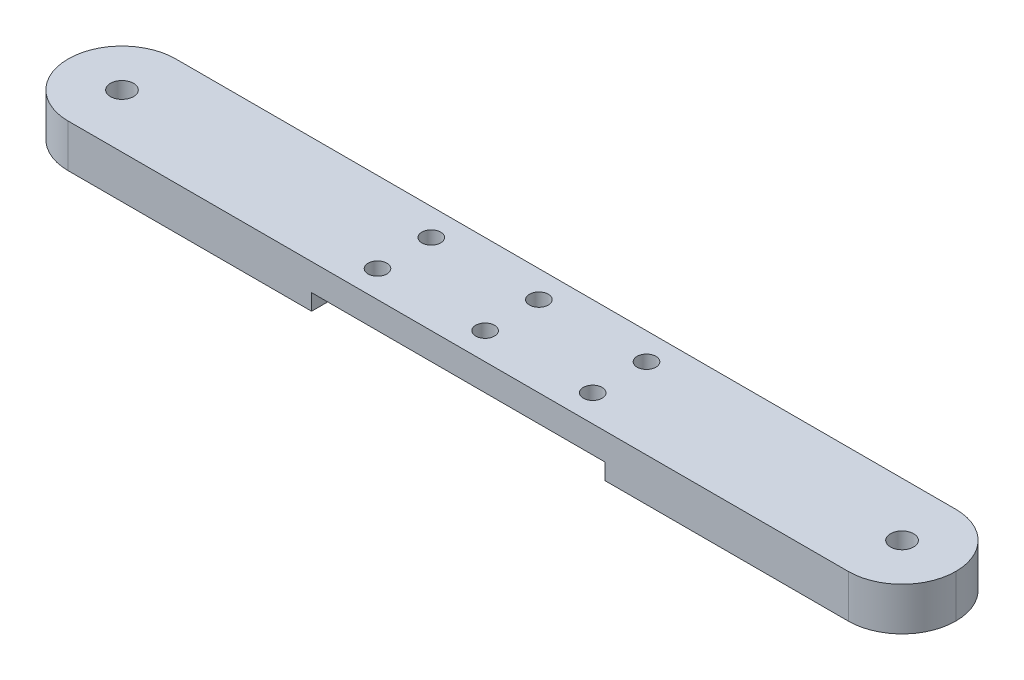
ISO-10303-21;
HEADER;
FILE_DESCRIPTION(('STEP AP214'),'2;1');
FILE_NAME('part.step','',(''),(''),'','','');
FILE_SCHEMA(('AUTOMOTIVE_DESIGN { 1 0 10303 214 1 1 1 1 }'));
ENDSEC;
DATA;
#1=APPLICATION_CONTEXT('core data for automotive mechanical design processes');
#2=APPLICATION_PROTOCOL_DEFINITION('international standard','automotive_design',2000,#1);
#3=PRODUCT_CONTEXT('',#1,'mechanical');
#4=PRODUCT('Part','Part','',(#3));
#5=PRODUCT_RELATED_PRODUCT_CATEGORY('part','',(#4));
#6=PRODUCT_DEFINITION_FORMATION('','',#4);
#7=PRODUCT_DEFINITION_CONTEXT('part definition',#1,'design');
#8=PRODUCT_DEFINITION('design','',#6,#7);
#9=PRODUCT_DEFINITION_SHAPE('','',#8);
#10=(LENGTH_UNIT() NAMED_UNIT(*) SI_UNIT(.MILLI.,.METRE.));
#11=(NAMED_UNIT(*) PLANE_ANGLE_UNIT() SI_UNIT($,.RADIAN.));
#12=(NAMED_UNIT(*) SI_UNIT($,.STERADIAN.) SOLID_ANGLE_UNIT());
#13=UNCERTAINTY_MEASURE_WITH_UNIT(LENGTH_MEASURE(1.E-05),#10,'distance_accuracy_value','');
#14=(GEOMETRIC_REPRESENTATION_CONTEXT(3) GLOBAL_UNCERTAINTY_ASSIGNED_CONTEXT((#13)) GLOBAL_UNIT_ASSIGNED_CONTEXT((#10,
#11,#12)) REPRESENTATION_CONTEXT('',''));
#15=CARTESIAN_POINT('',(0.,0.,0.));
#16=DIRECTION('',(0.,0.,1.));
#17=DIRECTION('',(1.,0.,0.));
#18=AXIS2_PLACEMENT_3D('',#15,#16,#17);
#19=CARTESIAN_POINT('',(-81.75,5.49999999999998,20.));
#20=DIRECTION('',(0.,-1.,0.));
#21=DIRECTION('',(0.,0.,-1.));
#22=AXIS2_PLACEMENT_3D('',#19,#20,#21);
#23=PLANE('',#22);
#24=CARTESIAN_POINT('',(-71.75,5.49999999999998,10.));
#25=DIRECTION('',(0.,1.,0.));
#26=DIRECTION('',(0.,0.,1.));
#27=AXIS2_PLACEMENT_3D('',#24,#25,#26);
#28=CIRCLE('',#27,2.15);
#29=CARTESIAN_POINT('',(-71.75,5.49999999999998,12.15));
#30=VERTEX_POINT('',#29);
#31=EDGE_CURVE('E193',#30,#30,#28,.T.);
#32=ORIENTED_EDGE('',*,*,#31,.F.);
#33=EDGE_LOOP('',(#32));
#34=FACE_BOUND('',#33,.T.);
#35=CARTESIAN_POINT('',(20.75,5.49999999999998,5.));
#36=DIRECTION('',(0.,1.,0.));
#37=DIRECTION('',(0.,0.,1.));
#38=AXIS2_PLACEMENT_3D('',#35,#36,#37);
#39=CIRCLE('',#38,1.75);
#40=CARTESIAN_POINT('',(20.75,5.49999999999998,6.75));
#41=VERTEX_POINT('',#40);
#42=EDGE_CURVE('E283',#41,#41,#39,.T.);
#43=ORIENTED_EDGE('',*,*,#42,.F.);
#44=EDGE_LOOP('',(#43));
#45=FACE_BOUND('',#44,.T.);
#46=CARTESIAN_POINT('',(0.750000000000004,5.49999999999998,5.));
#47=DIRECTION('',(0.,1.,0.));
#48=DIRECTION('',(0.,0.,1.));
#49=AXIS2_PLACEMENT_3D('',#46,#47,#48);
#50=CIRCLE('',#49,1.75);
#51=CARTESIAN_POINT('',(0.750000000000004,5.49999999999998,6.75));
#52=VERTEX_POINT('',#51);
#53=EDGE_CURVE('E289',#52,#52,#50,.T.);
#54=ORIENTED_EDGE('',*,*,#53,.F.);
#55=EDGE_LOOP('',(#54));
#56=FACE_BOUND('',#55,.T.);
#57=CARTESIAN_POINT('',(-19.25,5.49999999999998,5.));
#58=DIRECTION('',(0.,1.,0.));
#59=DIRECTION('',(0.,0.,1.));
#60=AXIS2_PLACEMENT_3D('',#57,#58,#59);
#61=CIRCLE('',#60,1.75);
#62=CARTESIAN_POINT('',(-19.25,5.49999999999998,6.75));
#63=VERTEX_POINT('',#62);
#64=EDGE_CURVE('E284',#63,#63,#61,.T.);
#65=ORIENTED_EDGE('',*,*,#64,.F.);
#66=EDGE_LOOP('',(#65));
#67=FACE_BOUND('',#66,.T.);
#68=CARTESIAN_POINT('',(73.25,5.49999999999998,10.));
#69=DIRECTION('',(0.,1.,0.));
#70=DIRECTION('',(0.,0.,1.));
#71=AXIS2_PLACEMENT_3D('',#68,#69,#70);
#72=CIRCLE('',#71,2.15);
#73=CARTESIAN_POINT('',(73.25,5.49999999999998,12.15));
#74=VERTEX_POINT('',#73);
#75=EDGE_CURVE('E288',#74,#74,#72,.T.);
#76=ORIENTED_EDGE('',*,*,#75,.F.);
#77=EDGE_LOOP('',(#76));
#78=FACE_BOUND('',#77,.T.);
#79=CARTESIAN_POINT('',(20.75,5.49999999999998,15.));
#80=DIRECTION('',(0.,1.,0.));
#81=DIRECTION('',(0.,0.,1.));
#82=AXIS2_PLACEMENT_3D('',#79,#80,#81);
#83=CIRCLE('',#82,1.75);
#84=CARTESIAN_POINT('',(20.75,5.49999999999998,16.75));
#85=VERTEX_POINT('',#84);
#86=EDGE_CURVE('E279',#85,#85,#83,.T.);
#87=ORIENTED_EDGE('',*,*,#86,.F.);
#88=EDGE_LOOP('',(#87));
#89=FACE_BOUND('',#88,.T.);
#90=CARTESIAN_POINT('',(0.750000000000004,5.49999999999998,15.));
#91=DIRECTION('',(0.,1.,0.));
#92=DIRECTION('',(0.,0.,1.));
#93=AXIS2_PLACEMENT_3D('',#90,#91,#92);
#94=CIRCLE('',#93,1.75);
#95=CARTESIAN_POINT('',(0.750000000000004,5.49999999999998,16.75));
#96=VERTEX_POINT('',#95);
#97=EDGE_CURVE('E261',#96,#96,#94,.T.);
#98=ORIENTED_EDGE('',*,*,#97,.F.);
#99=EDGE_LOOP('',(#98));
#100=FACE_BOUND('',#99,.T.);
#101=CARTESIAN_POINT('',(-19.25,5.49999999999998,15.));
#102=DIRECTION('',(0.,1.,0.));
#103=DIRECTION('',(0.,0.,1.));
#104=AXIS2_PLACEMENT_3D('',#101,#102,#103);
#105=CIRCLE('',#104,1.75);
#106=CARTESIAN_POINT('',(-19.25,5.49999999999998,16.75));
#107=VERTEX_POINT('',#106);
#108=EDGE_CURVE('E254',#107,#107,#105,.T.);
#109=ORIENTED_EDGE('',*,*,#108,.F.);
#110=EDGE_LOOP('',(#109));
#111=FACE_BOUND('',#110,.T.);
#112=CARTESIAN_POINT('',(73.25,5.49999999999998,10.));
#113=DIRECTION('',(0.,-1.,0.));
#114=DIRECTION('',(0.,0.,-1.));
#115=AXIS2_PLACEMENT_3D('',#112,#113,#114);
#116=CIRCLE('',#115,10.);
#117=CARTESIAN_POINT('',(73.25,5.49999999999998,20.));
#118=VERTEX_POINT('',#117);
#119=CARTESIAN_POINT('',(83.25,5.49999999999998,10.));
#120=VERTEX_POINT('',#119);
#121=EDGE_CURVE('E225',#118,#120,#116,.F.);
#122=ORIENTED_EDGE('',*,*,#121,.T.);
#123=CARTESIAN_POINT('',(73.25,5.49999999999998,10.));
#124=DIRECTION('',(0.,-1.,0.));
#125=DIRECTION('',(0.,0.,-1.));
#126=AXIS2_PLACEMENT_3D('',#123,#124,#125);
#127=CIRCLE('',#126,10.);
#128=CARTESIAN_POINT('',(73.25,5.49999999999998,0.));
#129=VERTEX_POINT('',#128);
#130=EDGE_CURVE('E228',#120,#129,#127,.F.);
#131=ORIENTED_EDGE('',*,*,#130,.T.);
#132=DIRECTION('',(-1.,0.,0.));
#133=VECTOR('',#132,1.);
#134=CARTESIAN_POINT('',(-81.75,5.49999999999998,0.));
#135=LINE('',#134,#133);
#136=CARTESIAN_POINT('',(-71.75,5.49999999999998,0.));
#137=VERTEX_POINT('',#136);
#138=EDGE_CURVE('E159',#129,#137,#135,.T.);
#139=ORIENTED_EDGE('',*,*,#138,.T.);
#140=CARTESIAN_POINT('',(-71.75,5.49999999999998,10.));
#141=DIRECTION('',(0.,-1.,0.));
#142=DIRECTION('',(0.,0.,-1.));
#143=AXIS2_PLACEMENT_3D('',#140,#141,#142);
#144=CIRCLE('',#143,10.);
#145=CARTESIAN_POINT('',(-81.75,5.49999999999998,10.));
#146=VERTEX_POINT('',#145);
#147=EDGE_CURVE('E222',#137,#146,#144,.F.);
#148=ORIENTED_EDGE('',*,*,#147,.T.);
#149=CARTESIAN_POINT('',(-71.75,5.49999999999998,10.));
#150=DIRECTION('',(0.,-1.,0.));
#151=DIRECTION('',(0.,0.,-1.));
#152=AXIS2_PLACEMENT_3D('',#149,#150,#151);
#153=CIRCLE('',#152,10.);
#154=CARTESIAN_POINT('',(-71.75,5.49999999999998,20.));
#155=VERTEX_POINT('',#154);
#156=EDGE_CURVE('E139',#146,#155,#153,.F.);
#157=ORIENTED_EDGE('',*,*,#156,.T.);
#158=DIRECTION('',(-1.,0.,0.));
#159=VECTOR('',#158,1.);
#160=CARTESIAN_POINT('',(-81.75,5.49999999999998,20.));
#161=LINE('',#160,#159);
#162=EDGE_CURVE('E129',#118,#155,#161,.T.);
#163=ORIENTED_EDGE('',*,*,#162,.F.);
#164=EDGE_LOOP('',(#122,#131,#139,#148,#157,#163));
#165=FACE_BOUND('',#164,.T.);
#166=ADVANCED_FACE('F45',(#34,#45,#56,#67,#78,#89,#100,#111,#165),#23,.F.);
#167=CARTESIAN_POINT('',(-81.75,-2.50000000000002,20.));
#168=DIRECTION('',(0.,1.,0.));
#169=DIRECTION('',(0.,0.,1.));
#170=AXIS2_PLACEMENT_3D('',#167,#168,#169);
#171=PLANE('',#170);
#172=CARTESIAN_POINT('',(-71.75,-2.50000000000002,10.));
#173=DIRECTION('',(0.,1.,0.));
#174=DIRECTION('',(0.,0.,1.));
#175=AXIS2_PLACEMENT_3D('',#172,#173,#174);
#176=CIRCLE('',#175,2.15);
#177=CARTESIAN_POINT('',(-71.75,-2.50000000000002,12.15));
#178=VERTEX_POINT('',#177);
#179=EDGE_CURVE('E163',#178,#178,#176,.T.);
#180=ORIENTED_EDGE('',*,*,#179,.T.);
#181=EDGE_LOOP('',(#180));
#182=FACE_BOUND('',#181,.T.);
#183=CARTESIAN_POINT('',(-71.75,-2.50000000000002,10.));
#184=DIRECTION('',(0.,1.,0.));
#185=DIRECTION('',(0.,0.,1.));
#186=AXIS2_PLACEMENT_3D('',#183,#184,#185);
#187=CIRCLE('',#186,10.);
#188=CARTESIAN_POINT('',(-71.75,-2.50000000000002,20.));
#189=VERTEX_POINT('',#188);
#190=CARTESIAN_POINT('',(-81.75,-2.50000000000002,10.));
#191=VERTEX_POINT('',#190);
#192=EDGE_CURVE('E55',#189,#191,#187,.F.);
#193=ORIENTED_EDGE('',*,*,#192,.T.);
#194=CARTESIAN_POINT('',(-71.75,-2.50000000000002,10.));
#195=DIRECTION('',(0.,1.,0.));
#196=DIRECTION('',(0.,0.,1.));
#197=AXIS2_PLACEMENT_3D('',#194,#195,#196);
#198=CIRCLE('',#197,10.);
#199=CARTESIAN_POINT('',(-71.75,-2.50000000000002,0.));
#200=VERTEX_POINT('',#199);
#201=EDGE_CURVE('E11',#191,#200,#198,.F.);
#202=ORIENTED_EDGE('',*,*,#201,.T.);
#203=DIRECTION('',(1.,0.,0.));
#204=VECTOR('',#203,1.);
#205=CARTESIAN_POINT('',(-81.75,-2.50000000000002,0.));
#206=LINE('',#205,#204);
#207=CARTESIAN_POINT('',(-26.5,-2.50000000000002,0.));
#208=VERTEX_POINT('',#207);
#209=EDGE_CURVE('E135',#200,#208,#206,.T.);
#210=ORIENTED_EDGE('',*,*,#209,.T.);
#211=DIRECTION('',(0.,0.,-1.));
#212=VECTOR('',#211,1.);
#213=CARTESIAN_POINT('',(-26.5,-2.50000000000002,20.));
#214=LINE('',#213,#212);
#215=CARTESIAN_POINT('',(-26.5,-2.50000000000002,20.));
#216=VERTEX_POINT('',#215);
#217=EDGE_CURVE('E132',#216,#208,#214,.T.);
#218=ORIENTED_EDGE('',*,*,#217,.F.);
#219=DIRECTION('',(1.,0.,0.));
#220=VECTOR('',#219,1.);
#221=CARTESIAN_POINT('',(-81.75,-2.50000000000002,20.));
#222=LINE('',#221,#220);
#223=EDGE_CURVE('E121',#189,#216,#222,.T.);
#224=ORIENTED_EDGE('',*,*,#223,.F.);
#225=EDGE_LOOP('',(#193,#202,#210,#218,#224));
#226=FACE_BOUND('',#225,.T.);
#227=ADVANCED_FACE('F133',(#182,#226),#171,.F.);
#228=CARTESIAN_POINT('',(-26.5,-2.50000000000002,20.));
#229=DIRECTION('',(-1.,0.,0.));
#230=DIRECTION('',(0.,-1.,0.));
#231=AXIS2_PLACEMENT_3D('',#228,#229,#230);
#232=PLANE('',#231);
#233=DIRECTION('',(0.,1.,0.));
#234=VECTOR('',#233,1.);
#235=CARTESIAN_POINT('',(-26.5,-2.50000000000002,0.));
#236=LINE('',#235,#234);
#237=CARTESIAN_POINT('',(-26.5,0.499999999999984,0.));
#238=VERTEX_POINT('',#237);
#239=EDGE_CURVE('E166',#208,#238,#236,.T.);
#240=ORIENTED_EDGE('',*,*,#239,.T.);
#241=DIRECTION('',(0.,0.,-1.));
#242=VECTOR('',#241,1.);
#243=CARTESIAN_POINT('',(-26.5,0.499999999999984,20.));
#244=LINE('',#243,#242);
#245=CARTESIAN_POINT('',(-26.5,0.499999999999984,20.));
#246=VERTEX_POINT('',#245);
#247=EDGE_CURVE('E140',#246,#238,#244,.T.);
#248=ORIENTED_EDGE('',*,*,#247,.F.);
#249=DIRECTION('',(0.,1.,0.));
#250=VECTOR('',#249,1.);
#251=CARTESIAN_POINT('',(-26.5,-2.50000000000002,20.));
#252=LINE('',#251,#250);
#253=EDGE_CURVE('E126',#216,#246,#252,.T.);
#254=ORIENTED_EDGE('',*,*,#253,.F.);
#255=ORIENTED_EDGE('',*,*,#217,.T.);
#256=EDGE_LOOP('',(#240,#248,#254,#255));
#257=FACE_BOUND('',#256,.T.);
#258=ADVANCED_FACE('F142',(#257),#232,.F.);
#259=CARTESIAN_POINT('',(-26.5,0.499999999999984,20.));
#260=DIRECTION('',(0.,1.,0.));
#261=DIRECTION('',(0.,0.,1.));
#262=AXIS2_PLACEMENT_3D('',#259,#260,#261);
#263=PLANE('',#262);
#264=CARTESIAN_POINT('',(20.75,0.499999999999985,5.));
#265=DIRECTION('',(0.,1.,0.));
#266=DIRECTION('',(0.,0.,1.));
#267=AXIS2_PLACEMENT_3D('',#264,#265,#266);
#268=CIRCLE('',#267,1.75);
#269=CARTESIAN_POINT('',(20.75,0.499999999999985,6.75));
#270=VERTEX_POINT('',#269);
#271=EDGE_CURVE('E213',#270,#270,#268,.T.);
#272=ORIENTED_EDGE('',*,*,#271,.T.);
#273=EDGE_LOOP('',(#272));
#274=FACE_BOUND('',#273,.T.);
#275=CARTESIAN_POINT('',(0.750000000000004,0.499999999999985,5.));
#276=DIRECTION('',(0.,1.,0.));
#277=DIRECTION('',(0.,0.,1.));
#278=AXIS2_PLACEMENT_3D('',#275,#276,#277);
#279=CIRCLE('',#278,1.75);
#280=CARTESIAN_POINT('',(0.750000000000004,0.499999999999985,6.75));
#281=VERTEX_POINT('',#280);
#282=EDGE_CURVE('E209',#281,#281,#279,.T.);
#283=ORIENTED_EDGE('',*,*,#282,.T.);
#284=EDGE_LOOP('',(#283));
#285=FACE_BOUND('',#284,.T.);
#286=CARTESIAN_POINT('',(-19.25,0.499999999999985,5.));
#287=DIRECTION('',(0.,1.,0.));
#288=DIRECTION('',(0.,0.,1.));
#289=AXIS2_PLACEMENT_3D('',#286,#287,#288);
#290=CIRCLE('',#289,1.75);
#291=CARTESIAN_POINT('',(-19.25,0.499999999999985,6.75));
#292=VERTEX_POINT('',#291);
#293=EDGE_CURVE('E205',#292,#292,#290,.T.);
#294=ORIENTED_EDGE('',*,*,#293,.T.);
#295=EDGE_LOOP('',(#294));
#296=FACE_BOUND('',#295,.T.);
#297=CARTESIAN_POINT('',(20.75,0.499999999999985,15.));
#298=DIRECTION('',(0.,1.,0.));
#299=DIRECTION('',(0.,0.,1.));
#300=AXIS2_PLACEMENT_3D('',#297,#298,#299);
#301=CIRCLE('',#300,1.75);
#302=CARTESIAN_POINT('',(20.75,0.499999999999985,16.75));
#303=VERTEX_POINT('',#302);
#304=EDGE_CURVE('E201',#303,#303,#301,.T.);
#305=ORIENTED_EDGE('',*,*,#304,.T.);
#306=EDGE_LOOP('',(#305));
#307=FACE_BOUND('',#306,.T.);
#308=CARTESIAN_POINT('',(0.750000000000004,0.499999999999985,15.));
#309=DIRECTION('',(0.,1.,0.));
#310=DIRECTION('',(0.,0.,1.));
#311=AXIS2_PLACEMENT_3D('',#308,#309,#310);
#312=CIRCLE('',#311,1.75);
#313=CARTESIAN_POINT('',(0.750000000000004,0.499999999999985,16.75));
#314=VERTEX_POINT('',#313);
#315=EDGE_CURVE('E197',#314,#314,#312,.T.);
#316=ORIENTED_EDGE('',*,*,#315,.T.);
#317=EDGE_LOOP('',(#316));
#318=FACE_BOUND('',#317,.T.);
#319=CARTESIAN_POINT('',(-19.25,0.499999999999985,15.));
#320=DIRECTION('',(0.,1.,0.));
#321=DIRECTION('',(0.,0.,1.));
#322=AXIS2_PLACEMENT_3D('',#319,#320,#321);
#323=CIRCLE('',#322,1.75);
#324=CARTESIAN_POINT('',(-19.25,0.499999999999985,16.75));
#325=VERTEX_POINT('',#324);
#326=EDGE_CURVE('E192',#325,#325,#323,.T.);
#327=ORIENTED_EDGE('',*,*,#326,.T.);
#328=EDGE_LOOP('',(#327));
#329=FACE_BOUND('',#328,.T.);
#330=DIRECTION('',(1.,0.,0.));
#331=VECTOR('',#330,1.);
#332=CARTESIAN_POINT('',(-26.5,0.499999999999984,0.));
#333=LINE('',#332,#331);
#334=CARTESIAN_POINT('',(28.,0.499999999999984,0.));
#335=VERTEX_POINT('',#334);
#336=EDGE_CURVE('E169',#238,#335,#333,.T.);
#337=ORIENTED_EDGE('',*,*,#336,.T.);
#338=DIRECTION('',(0.,0.,-1.));
#339=VECTOR('',#338,1.);
#340=CARTESIAN_POINT('',(28.,0.499999999999984,20.));
#341=LINE('',#340,#339);
#342=CARTESIAN_POINT('',(28.,0.499999999999984,20.));
#343=VERTEX_POINT('',#342);
#344=EDGE_CURVE('E182',#343,#335,#341,.T.);
#345=ORIENTED_EDGE('',*,*,#344,.F.);
#346=DIRECTION('',(1.,0.,0.));
#347=VECTOR('',#346,1.);
#348=CARTESIAN_POINT('',(-26.5,0.499999999999984,20.));
#349=LINE('',#348,#347);
#350=EDGE_CURVE('E146',#246,#343,#349,.T.);
#351=ORIENTED_EDGE('',*,*,#350,.F.);
#352=ORIENTED_EDGE('',*,*,#247,.T.);
#353=EDGE_LOOP('',(#337,#345,#351,#352));
#354=FACE_BOUND('',#353,.T.);
#355=ADVANCED_FACE('F331',(#274,#285,#296,#307,#318,#329,#354),#263,.F.);
#356=CARTESIAN_POINT('',(28.,-2.50000000000002,20.));
#357=DIRECTION('',(1.,0.,0.));
#358=DIRECTION('',(0.,0.,-1.));
#359=AXIS2_PLACEMENT_3D('',#356,#357,#358);
#360=PLANE('',#359);
#361=DIRECTION('',(0.,-1.,0.));
#362=VECTOR('',#361,1.);
#363=CARTESIAN_POINT('',(28.,-2.50000000000002,0.));
#364=LINE('',#363,#362);
#365=CARTESIAN_POINT('',(28.,-2.50000000000002,0.));
#366=VERTEX_POINT('',#365);
#367=EDGE_CURVE('E172',#335,#366,#364,.T.);
#368=ORIENTED_EDGE('',*,*,#367,.T.);
#369=DIRECTION('',(0.,0.,-1.));
#370=VECTOR('',#369,1.);
#371=CARTESIAN_POINT('',(28.,-2.50000000000002,20.));
#372=LINE('',#371,#370);
#373=CARTESIAN_POINT('',(28.,-2.50000000000002,20.));
#374=VERTEX_POINT('',#373);
#375=EDGE_CURVE('E158',#374,#366,#372,.T.);
#376=ORIENTED_EDGE('',*,*,#375,.F.);
#377=DIRECTION('',(0.,-1.,0.));
#378=VECTOR('',#377,1.);
#379=CARTESIAN_POINT('',(28.,-2.50000000000002,20.));
#380=LINE('',#379,#378);
#381=EDGE_CURVE('E149',#343,#374,#380,.T.);
#382=ORIENTED_EDGE('',*,*,#381,.F.);
#383=ORIENTED_EDGE('',*,*,#344,.T.);
#384=EDGE_LOOP('',(#368,#376,#382,#383));
#385=FACE_BOUND('',#384,.T.);
#386=ADVANCED_FACE('F334',(#385),#360,.F.);
#387=CARTESIAN_POINT('',(28.,-2.50000000000002,20.));
#388=DIRECTION('',(0.,1.,0.));
#389=DIRECTION('',(0.,0.,1.));
#390=AXIS2_PLACEMENT_3D('',#387,#388,#389);
#391=PLANE('',#390);
#392=CARTESIAN_POINT('',(73.25,-2.50000000000002,10.));
#393=DIRECTION('',(0.,1.,0.));
#394=DIRECTION('',(0.,0.,1.));
#395=AXIS2_PLACEMENT_3D('',#392,#393,#394);
#396=CIRCLE('',#395,2.15);
#397=CARTESIAN_POINT('',(73.25,-2.50000000000002,12.15));
#398=VERTEX_POINT('',#397);
#399=EDGE_CURVE('E188',#398,#398,#396,.T.);
#400=ORIENTED_EDGE('',*,*,#399,.T.);
#401=EDGE_LOOP('',(#400));
#402=FACE_BOUND('',#401,.T.);
#403=DIRECTION('',(1.,0.,0.));
#404=VECTOR('',#403,1.);
#405=CARTESIAN_POINT('',(28.,-2.50000000000002,0.));
#406=LINE('',#405,#404);
#407=CARTESIAN_POINT('',(73.25,-2.50000000000002,0.));
#408=VERTEX_POINT('',#407);
#409=EDGE_CURVE('E175',#366,#408,#406,.T.);
#410=ORIENTED_EDGE('',*,*,#409,.T.);
#411=CARTESIAN_POINT('',(73.25,-2.50000000000002,10.));
#412=DIRECTION('',(0.,1.,0.));
#413=DIRECTION('',(0.,0.,1.));
#414=AXIS2_PLACEMENT_3D('',#411,#412,#413);
#415=CIRCLE('',#414,10.);
#416=CARTESIAN_POINT('',(83.25,-2.50000000000002,10.));
#417=VERTEX_POINT('',#416);
#418=EDGE_CURVE('E242',#408,#417,#415,.F.);
#419=ORIENTED_EDGE('',*,*,#418,.T.);
#420=CARTESIAN_POINT('',(73.25,-2.50000000000002,10.));
#421=DIRECTION('',(0.,1.,0.));
#422=DIRECTION('',(0.,0.,1.));
#423=AXIS2_PLACEMENT_3D('',#420,#421,#422);
#424=CIRCLE('',#423,10.);
#425=CARTESIAN_POINT('',(73.25,-2.50000000000002,20.));
#426=VERTEX_POINT('',#425);
#427=EDGE_CURVE('E239',#417,#426,#424,.F.);
#428=ORIENTED_EDGE('',*,*,#427,.T.);
#429=DIRECTION('',(1.,0.,0.));
#430=VECTOR('',#429,1.);
#431=CARTESIAN_POINT('',(28.,-2.50000000000002,20.));
#432=LINE('',#431,#430);
#433=EDGE_CURVE('E155',#374,#426,#432,.T.);
#434=ORIENTED_EDGE('',*,*,#433,.F.);
#435=ORIENTED_EDGE('',*,*,#375,.T.);
#436=EDGE_LOOP('',(#410,#419,#428,#434,#435));
#437=FACE_BOUND('',#436,.T.);
#438=ADVANCED_FACE('F349',(#402,#437),#391,.F.);
#439=CARTESIAN_POINT('',(0.,0.,20.));
#440=DIRECTION('',(0.,0.,1.));
#441=DIRECTION('',(1.,0.,0.));
#442=AXIS2_PLACEMENT_3D('',#439,#440,#441);
#443=PLANE('',#442);
#444=ORIENTED_EDGE('',*,*,#433,.T.);
#445=DIRECTION('',(0.,1.,0.));
#446=VECTOR('',#445,1.);
#447=CARTESIAN_POINT('',(73.25,5.49999999999998,20.));
#448=LINE('',#447,#446);
#449=EDGE_CURVE('E247',#426,#118,#448,.T.);
#450=ORIENTED_EDGE('',*,*,#449,.T.);
#451=ORIENTED_EDGE('',*,*,#162,.T.);
#452=DIRECTION('',(0.,-1.,0.));
#453=VECTOR('',#452,1.);
#454=CARTESIAN_POINT('',(-71.75,-2.50000000000002,20.));
#455=LINE('',#454,#453);
#456=EDGE_CURVE('E69',#155,#189,#455,.T.);
#457=ORIENTED_EDGE('',*,*,#456,.T.);
#458=ORIENTED_EDGE('',*,*,#223,.T.);
#459=ORIENTED_EDGE('',*,*,#253,.T.);
#460=ORIENTED_EDGE('',*,*,#350,.T.);
#461=ORIENTED_EDGE('',*,*,#381,.T.);
#462=EDGE_LOOP('',(#444,#450,#451,#457,#458,#459,#460,#461));
#463=FACE_BOUND('',#462,.T.);
#464=ADVANCED_FACE('F124',(#463),#443,.T.);
#465=CARTESIAN_POINT('',(0.,0.,0.));
#466=DIRECTION('',(0.,0.,1.));
#467=DIRECTION('',(1.,0.,0.));
#468=AXIS2_PLACEMENT_3D('',#465,#466,#467);
#469=PLANE('',#468);
#470=ORIENTED_EDGE('',*,*,#138,.F.);
#471=DIRECTION('',(0.,1.,0.));
#472=VECTOR('',#471,1.);
#473=CARTESIAN_POINT('',(73.25,0.,0.));
#474=LINE('',#473,#472);
#475=EDGE_CURVE('E235',#129,#408,#474,.F.);
#476=ORIENTED_EDGE('',*,*,#475,.T.);
#477=ORIENTED_EDGE('',*,*,#409,.F.);
#478=ORIENTED_EDGE('',*,*,#367,.F.);
#479=ORIENTED_EDGE('',*,*,#336,.F.);
#480=ORIENTED_EDGE('',*,*,#239,.F.);
#481=ORIENTED_EDGE('',*,*,#209,.F.);
#482=DIRECTION('',(0.,-1.,0.));
#483=VECTOR('',#482,1.);
#484=CARTESIAN_POINT('',(-71.75,0.,0.));
#485=LINE('',#484,#483);
#486=EDGE_CURVE('E231',#200,#137,#485,.F.);
#487=ORIENTED_EDGE('',*,*,#486,.T.);
#488=EDGE_LOOP('',(#470,#476,#477,#478,#479,#480,#481,#487));
#489=FACE_BOUND('',#488,.T.);
#490=ADVANCED_FACE('F346',(#489),#469,.F.);
#491=CARTESIAN_POINT('',(73.25,-14.5,10.));
#492=DIRECTION('',(0.,1.,0.));
#493=DIRECTION('',(0.,0.,1.));
#494=AXIS2_PLACEMENT_3D('',#491,#492,#493);
#495=CYLINDRICAL_SURFACE('',#494,2.15);
#496=ORIENTED_EDGE('',*,*,#75,.T.);
#497=EDGE_LOOP('',(#496));
#498=FACE_BOUND('',#497,.T.);
#499=ORIENTED_EDGE('',*,*,#399,.F.);
#500=EDGE_LOOP('',(#499));
#501=FACE_BOUND('',#500,.T.);
#502=ADVANCED_FACE('F327',(#498,#501),#495,.F.);
#503=CARTESIAN_POINT('',(-19.25,-14.5,15.));
#504=DIRECTION('',(0.,1.,0.));
#505=DIRECTION('',(0.,0.,1.));
#506=AXIS2_PLACEMENT_3D('',#503,#504,#505);
#507=CYLINDRICAL_SURFACE('',#506,1.75);
#508=ORIENTED_EDGE('',*,*,#108,.T.);
#509=EDGE_LOOP('',(#508));
#510=FACE_BOUND('',#509,.T.);
#511=ORIENTED_EDGE('',*,*,#326,.F.);
#512=EDGE_LOOP('',(#511));
#513=FACE_BOUND('',#512,.T.);
#514=ADVANCED_FACE('F323',(#510,#513),#507,.F.);
#515=CARTESIAN_POINT('',(0.750000000000004,-14.5,15.));
#516=DIRECTION('',(0.,1.,0.));
#517=DIRECTION('',(0.,0.,1.));
#518=AXIS2_PLACEMENT_3D('',#515,#516,#517);
#519=CYLINDRICAL_SURFACE('',#518,1.75);
#520=ORIENTED_EDGE('',*,*,#97,.T.);
#521=EDGE_LOOP('',(#520));
#522=FACE_BOUND('',#521,.T.);
#523=ORIENTED_EDGE('',*,*,#315,.F.);
#524=EDGE_LOOP('',(#523));
#525=FACE_BOUND('',#524,.T.);
#526=ADVANCED_FACE('F326',(#522,#525),#519,.F.);
#527=CARTESIAN_POINT('',(20.75,-14.5,15.));
#528=DIRECTION('',(0.,1.,0.));
#529=DIRECTION('',(0.,0.,1.));
#530=AXIS2_PLACEMENT_3D('',#527,#528,#529);
#531=CYLINDRICAL_SURFACE('',#530,1.75);
#532=ORIENTED_EDGE('',*,*,#86,.T.);
#533=EDGE_LOOP('',(#532));
#534=FACE_BOUND('',#533,.T.);
#535=ORIENTED_EDGE('',*,*,#304,.F.);
#536=EDGE_LOOP('',(#535));
#537=FACE_BOUND('',#536,.T.);
#538=ADVANCED_FACE('F421',(#534,#537),#531,.F.);
#539=CARTESIAN_POINT('',(-19.25,-14.5,5.));
#540=DIRECTION('',(0.,1.,0.));
#541=DIRECTION('',(0.,0.,1.));
#542=AXIS2_PLACEMENT_3D('',#539,#540,#541);
#543=CYLINDRICAL_SURFACE('',#542,1.75);
#544=ORIENTED_EDGE('',*,*,#64,.T.);
#545=EDGE_LOOP('',(#544));
#546=FACE_BOUND('',#545,.T.);
#547=ORIENTED_EDGE('',*,*,#293,.F.);
#548=EDGE_LOOP('',(#547));
#549=FACE_BOUND('',#548,.T.);
#550=ADVANCED_FACE('F411',(#546,#549),#543,.F.);
#551=CARTESIAN_POINT('',(0.750000000000004,-14.5,5.));
#552=DIRECTION('',(0.,1.,0.));
#553=DIRECTION('',(0.,0.,1.));
#554=AXIS2_PLACEMENT_3D('',#551,#552,#553);
#555=CYLINDRICAL_SURFACE('',#554,1.75);
#556=ORIENTED_EDGE('',*,*,#53,.T.);
#557=EDGE_LOOP('',(#556));
#558=FACE_BOUND('',#557,.T.);
#559=ORIENTED_EDGE('',*,*,#282,.F.);
#560=EDGE_LOOP('',(#559));
#561=FACE_BOUND('',#560,.T.);
#562=ADVANCED_FACE('F401',(#558,#561),#555,.F.);
#563=CARTESIAN_POINT('',(20.75,-14.5,5.));
#564=DIRECTION('',(0.,1.,0.));
#565=DIRECTION('',(0.,0.,1.));
#566=AXIS2_PLACEMENT_3D('',#563,#564,#565);
#567=CYLINDRICAL_SURFACE('',#566,1.75);
#568=ORIENTED_EDGE('',*,*,#42,.T.);
#569=EDGE_LOOP('',(#568));
#570=FACE_BOUND('',#569,.T.);
#571=ORIENTED_EDGE('',*,*,#271,.F.);
#572=EDGE_LOOP('',(#571));
#573=FACE_BOUND('',#572,.T.);
#574=ADVANCED_FACE('F392',(#570,#573),#567,.F.);
#575=CARTESIAN_POINT('',(-71.75,-14.5,10.));
#576=DIRECTION('',(0.,1.,0.));
#577=DIRECTION('',(0.,0.,1.));
#578=AXIS2_PLACEMENT_3D('',#575,#576,#577);
#579=CYLINDRICAL_SURFACE('',#578,2.15);
#580=ORIENTED_EDGE('',*,*,#31,.T.);
#581=EDGE_LOOP('',(#580));
#582=FACE_BOUND('',#581,.T.);
#583=ORIENTED_EDGE('',*,*,#179,.F.);
#584=EDGE_LOOP('',(#583));
#585=FACE_BOUND('',#584,.T.);
#586=ADVANCED_FACE('F303',(#582,#585),#579,.F.);
#587=CARTESIAN_POINT('',(73.25,0.,10.));
#588=DIRECTION('',(0.,-1.,0.));
#589=DIRECTION('',(0.,0.,-1.));
#590=AXIS2_PLACEMENT_3D('',#587,#588,#589);
#591=CYLINDRICAL_SURFACE('',#590,10.);
#592=ORIENTED_EDGE('',*,*,#449,.F.);
#593=ORIENTED_EDGE('',*,*,#427,.F.);
#594=DIRECTION('',(0.,1.,0.));
#595=VECTOR('',#594,1.);
#596=CARTESIAN_POINT('',(83.25,-2.50000000000002,10.));
#597=LINE('',#596,#595);
#598=EDGE_CURVE('E251',#120,#417,#597,.F.);
#599=ORIENTED_EDGE('',*,*,#598,.F.);
#600=ORIENTED_EDGE('',*,*,#121,.F.);
#601=EDGE_LOOP('',(#592,#593,#599,#600));
#602=FACE_BOUND('',#601,.T.);
#603=ADVANCED_FACE('F353',(#602),#591,.T.);
#604=CARTESIAN_POINT('',(73.25,5.49999999999998,10.));
#605=DIRECTION('',(0.,1.,0.));
#606=DIRECTION('',(0.,0.,1.));
#607=AXIS2_PLACEMENT_3D('',#604,#605,#606);
#608=CYLINDRICAL_SURFACE('',#607,10.);
#609=ORIENTED_EDGE('',*,*,#418,.F.);
#610=ORIENTED_EDGE('',*,*,#475,.F.);
#611=ORIENTED_EDGE('',*,*,#130,.F.);
#612=ORIENTED_EDGE('',*,*,#598,.T.);
#613=EDGE_LOOP('',(#609,#610,#611,#612));
#614=FACE_BOUND('',#613,.T.);
#615=ADVANCED_FACE('F354',(#614),#608,.T.);
#616=CARTESIAN_POINT('',(-71.75,0.,10.));
#617=DIRECTION('',(0.,1.,0.));
#618=DIRECTION('',(0.,0.,1.));
#619=AXIS2_PLACEMENT_3D('',#616,#617,#618);
#620=CYLINDRICAL_SURFACE('',#619,10.);
#621=ORIENTED_EDGE('',*,*,#456,.F.);
#622=ORIENTED_EDGE('',*,*,#156,.F.);
#623=DIRECTION('',(0.,-1.,0.));
#624=VECTOR('',#623,1.);
#625=CARTESIAN_POINT('',(-81.75,5.49999999999998,10.));
#626=LINE('',#625,#624);
#627=EDGE_CURVE('E49',#191,#146,#626,.F.);
#628=ORIENTED_EDGE('',*,*,#627,.F.);
#629=ORIENTED_EDGE('',*,*,#192,.F.);
#630=EDGE_LOOP('',(#621,#622,#628,#629));
#631=FACE_BOUND('',#630,.T.);
#632=ADVANCED_FACE('F47',(#631),#620,.T.);
#633=CARTESIAN_POINT('',(-71.75,5.49999999999998,10.));
#634=DIRECTION('',(0.,-1.,0.));
#635=DIRECTION('',(0.,0.,-1.));
#636=AXIS2_PLACEMENT_3D('',#633,#634,#635);
#637=CYLINDRICAL_SURFACE('',#636,10.);
#638=ORIENTED_EDGE('',*,*,#147,.F.);
#639=ORIENTED_EDGE('',*,*,#486,.F.);
#640=ORIENTED_EDGE('',*,*,#201,.F.);
#641=ORIENTED_EDGE('',*,*,#627,.T.);
#642=EDGE_LOOP('',(#638,#639,#640,#641));
#643=FACE_BOUND('',#642,.T.);
#644=ADVANCED_FACE('F266',(#643),#637,.T.);
#645=CLOSED_SHELL('',(#166,#227,#258,#355,#386,#438,#464,#490,#502,#514,#526,#538,#550,#562,
#574,#586,#603,#615,#632,#644));
#646=MANIFOLD_SOLID_BREP('B2',#645);
#647=ADVANCED_BREP_SHAPE_REPRESENTATION('',(#18,#646),#14);
#648=SHAPE_DEFINITION_REPRESENTATION(#9,#647);
ENDSEC;
END-ISO-10303-21;
